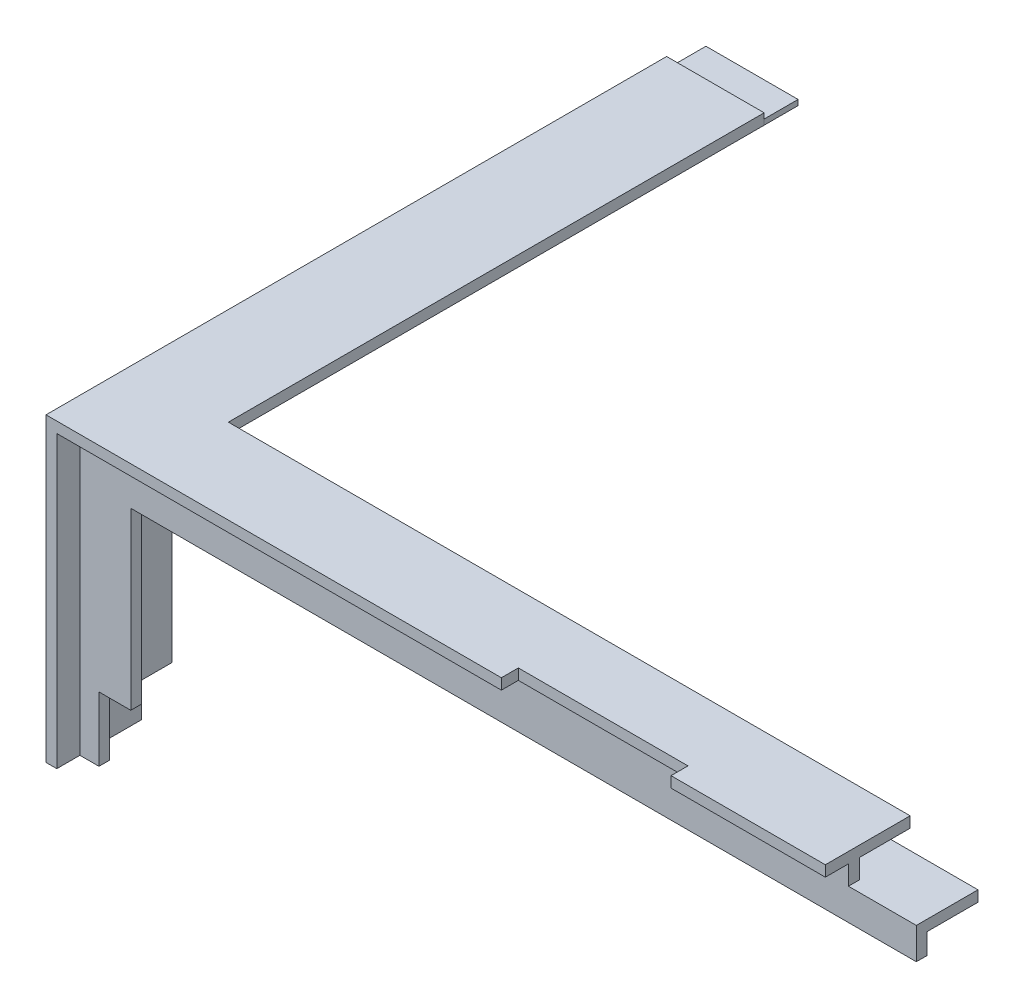
ISO-10303-21;
HEADER;
FILE_DESCRIPTION(('STEP AP214'),'2;1');
FILE_NAME('part.step','',(''),(''),'','','');
FILE_SCHEMA(('AUTOMOTIVE_DESIGN { 1 0 10303 214 1 1 1 1 }'));
ENDSEC;
DATA;
#1=APPLICATION_CONTEXT('core data for automotive mechanical design processes');
#2=APPLICATION_PROTOCOL_DEFINITION('international standard','automotive_design',2000,#1);
#3=PRODUCT_CONTEXT('',#1,'mechanical');
#4=PRODUCT('Part','Part','',(#3));
#5=PRODUCT_RELATED_PRODUCT_CATEGORY('part','',(#4));
#6=PRODUCT_DEFINITION_FORMATION('','',#4);
#7=PRODUCT_DEFINITION_CONTEXT('part definition',#1,'design');
#8=PRODUCT_DEFINITION('design','',#6,#7);
#9=PRODUCT_DEFINITION_SHAPE('','',#8);
#10=(LENGTH_UNIT() NAMED_UNIT(*) SI_UNIT(.MILLI.,.METRE.));
#11=(NAMED_UNIT(*) PLANE_ANGLE_UNIT() SI_UNIT($,.RADIAN.));
#12=(NAMED_UNIT(*) SI_UNIT($,.STERADIAN.) SOLID_ANGLE_UNIT());
#13=UNCERTAINTY_MEASURE_WITH_UNIT(LENGTH_MEASURE(1.E-05),#10,'distance_accuracy_value','');
#14=(GEOMETRIC_REPRESENTATION_CONTEXT(3) GLOBAL_UNCERTAINTY_ASSIGNED_CONTEXT((#13)) GLOBAL_UNIT_ASSIGNED_CONTEXT((#10,
#11,#12)) REPRESENTATION_CONTEXT('',''));
#15=CARTESIAN_POINT('',(0.,0.,0.));
#16=DIRECTION('',(0.,0.,1.));
#17=DIRECTION('',(1.,0.,0.));
#18=AXIS2_PLACEMENT_3D('',#15,#16,#17);
#19=CARTESIAN_POINT('',(244.15125,489.407550000029,28.18));
#20=DIRECTION('',(1.,0.,0.));
#21=DIRECTION('',(0.,0.,-1.));
#22=AXIS2_PLACEMENT_3D('',#19,#20,#21);
#23=PLANE('',#22);
#24=DIRECTION('',(0.,1.,0.));
#25=VECTOR('',#24,1.);
#26=CARTESIAN_POINT('',(244.15125,0.,3.18));
#27=LINE('',#26,#25);
#28=CARTESIAN_POINT('',(244.15125,480.122550000029,3.18));
#29=VERTEX_POINT('',#28);
#30=CARTESIAN_POINT('',(244.15125,489.407550000029,3.18));
#31=VERTEX_POINT('',#30);
#32=EDGE_CURVE('E154',#29,#31,#27,.T.);
#33=ORIENTED_EDGE('',*,*,#32,.F.);
#34=DIRECTION('',(0.,0.,-1.));
#35=VECTOR('',#34,1.);
#36=CARTESIAN_POINT('',(244.15125,480.122550000029,-398.95052983774));
#37=LINE('',#36,#35);
#38=CARTESIAN_POINT('',(244.15125,480.122550000029,0.));
#39=VERTEX_POINT('',#38);
#40=EDGE_CURVE('E205',#29,#39,#37,.T.);
#41=ORIENTED_EDGE('',*,*,#40,.T.);
#42=DIRECTION('',(0.,1.,0.));
#43=VECTOR('',#42,1.);
#44=CARTESIAN_POINT('',(244.15125,0.,0.));
#45=LINE('',#44,#43);
#46=CARTESIAN_POINT('',(244.15125,486.227550000029,0.));
#47=VERTEX_POINT('',#46);
#48=EDGE_CURVE('E184',#39,#47,#45,.T.);
#49=ORIENTED_EDGE('',*,*,#48,.T.);
#50=DIRECTION('',(0.,0.,-1.));
#51=VECTOR('',#50,1.);
#52=CARTESIAN_POINT('',(244.15125,486.227550000029,-15.));
#53=LINE('',#52,#51);
#54=CARTESIAN_POINT('',(244.15125,486.227550000029,-15.));
#55=VERTEX_POINT('',#54);
#56=EDGE_CURVE('E190',#47,#55,#53,.T.);
#57=ORIENTED_EDGE('',*,*,#56,.T.);
#58=DIRECTION('',(0.,-1.,0.));
#59=VECTOR('',#58,1.);
#60=CARTESIAN_POINT('',(244.15125,0.,-15.));
#61=LINE('',#60,#59);
#62=CARTESIAN_POINT('',(244.15125,489.407550000029,-15.));
#63=VERTEX_POINT('',#62);
#64=EDGE_CURVE('E136',#63,#55,#61,.T.);
#65=ORIENTED_EDGE('',*,*,#64,.F.);
#66=DIRECTION('',(0.,0.,-1.));
#67=VECTOR('',#66,1.);
#68=CARTESIAN_POINT('',(244.15125,489.407550000029,28.18));
#69=LINE('',#68,#67);
#70=EDGE_CURVE('E121',#31,#63,#69,.T.);
#71=ORIENTED_EDGE('',*,*,#70,.F.);
#72=EDGE_LOOP('',(#33,#41,#49,#57,#65,#71));
#73=FACE_BOUND('',#72,.T.);
#74=ADVANCED_FACE('F38',(#73),#23,.T.);
#75=CARTESIAN_POINT('',(224.15125,502.016950330966,28.18));
#76=DIRECTION('',(1.,0.,0.));
#77=DIRECTION('',(0.,0.,-1.));
#78=AXIS2_PLACEMENT_3D('',#75,#76,#77);
#79=PLANE('',#78);
#80=DIRECTION('',(0.,1.,0.));
#81=VECTOR('',#80,1.);
#82=CARTESIAN_POINT('',(224.15125,0.,3.18));
#83=LINE('',#82,#81);
#84=CARTESIAN_POINT('',(224.15125,489.407550000029,3.18));
#85=VERTEX_POINT('',#84);
#86=CARTESIAN_POINT('',(224.15125,495.122550000029,3.18));
#87=VERTEX_POINT('',#86);
#88=EDGE_CURVE('E160',#85,#87,#83,.T.);
#89=ORIENTED_EDGE('',*,*,#88,.F.);
#90=DIRECTION('',(0.,0.,-1.));
#91=VECTOR('',#90,1.);
#92=CARTESIAN_POINT('',(224.15125,489.407550000029,28.18));
#93=LINE('',#92,#91);
#94=CARTESIAN_POINT('',(224.15125,489.407550000029,0.));
#95=VERTEX_POINT('',#94);
#96=EDGE_CURVE('E124',#85,#95,#93,.T.);
#97=ORIENTED_EDGE('',*,*,#96,.T.);
#98=DIRECTION('',(0.,1.,0.));
#99=VECTOR('',#98,1.);
#100=CARTESIAN_POINT('',(224.15125,0.,0.));
#101=LINE('',#100,#99);
#102=CARTESIAN_POINT('',(224.15125,495.122550000029,0.));
#103=VERTEX_POINT('',#102);
#104=EDGE_CURVE('E172',#95,#103,#101,.T.);
#105=ORIENTED_EDGE('',*,*,#104,.T.);
#106=DIRECTION('',(0.,0.,-1.));
#107=VECTOR('',#106,1.);
#108=CARTESIAN_POINT('',(224.15125,495.122550000029,-172.932));
#109=LINE('',#108,#107);
#110=CARTESIAN_POINT('',(224.15125,495.122550000029,-15.));
#111=VERTEX_POINT('',#110);
#112=EDGE_CURVE('E199',#103,#111,#109,.T.);
#113=ORIENTED_EDGE('',*,*,#112,.T.);
#114=DIRECTION('',(0.,1.,0.));
#115=VECTOR('',#114,1.);
#116=CARTESIAN_POINT('',(224.15125,0.,-15.));
#117=LINE('',#116,#115);
#118=CARTESIAN_POINT('',(224.15125,498.297550000029,-15.));
#119=VERTEX_POINT('',#118);
#120=EDGE_CURVE('E211',#111,#119,#117,.T.);
#121=ORIENTED_EDGE('',*,*,#120,.T.);
#122=DIRECTION('',(0.,0.,1.));
#123=VECTOR('',#122,1.);
#124=CARTESIAN_POINT('',(224.15125,498.297550000029,10.));
#125=LINE('',#124,#123);
#126=CARTESIAN_POINT('',(224.15125,498.297550000029,10.));
#127=VERTEX_POINT('',#126);
#128=EDGE_CURVE('E193',#119,#127,#125,.T.);
#129=ORIENTED_EDGE('',*,*,#128,.T.);
#130=DIRECTION('',(0.,1.,0.));
#131=VECTOR('',#130,1.);
#132=CARTESIAN_POINT('',(224.15125,0.,10.));
#133=LINE('',#132,#131);
#134=CARTESIAN_POINT('',(224.15125,495.122550000029,10.));
#135=VERTEX_POINT('',#134);
#136=EDGE_CURVE('E163',#135,#127,#133,.T.);
#137=ORIENTED_EDGE('',*,*,#136,.F.);
#138=DIRECTION('',(0.,0.,1.));
#139=VECTOR('',#138,1.);
#140=CARTESIAN_POINT('',(224.15125,495.122550000029,10.));
#141=LINE('',#140,#139);
#142=EDGE_CURVE('E166',#87,#135,#141,.T.);
#143=ORIENTED_EDGE('',*,*,#142,.F.);
#144=EDGE_LOOP('',(#89,#97,#105,#113,#121,#129,#137,#143));
#145=FACE_BOUND('',#144,.T.);
#146=ADVANCED_FACE('F547',(#145),#79,.T.);
#147=CARTESIAN_POINT('',(224.15125,489.407550000029,28.18));
#148=DIRECTION('',(0.,1.,0.));
#149=DIRECTION('',(-1.,0.,0.));
#150=AXIS2_PLACEMENT_3D('',#147,#148,#149);
#151=PLANE('',#150);
#152=DIRECTION('',(-1.,0.,0.));
#153=VECTOR('',#152,1.);
#154=CARTESIAN_POINT('',(1.35837882608855E-12,489.40755000003,3.18));
#155=LINE('',#154,#153);
#156=EDGE_CURVE('E157',#31,#85,#155,.T.);
#157=ORIENTED_EDGE('',*,*,#156,.F.);
#158=ORIENTED_EDGE('',*,*,#70,.T.);
#159=DIRECTION('',(1.,0.,0.));
#160=VECTOR('',#159,1.);
#161=CARTESIAN_POINT('',(304.00625,489.407550000029,-15.));
#162=LINE('',#161,#160);
#163=CARTESIAN_POINT('',(3.33375000000002,489.407550000029,-15.));
#164=VERTEX_POINT('',#163);
#165=EDGE_CURVE('E272',#164,#63,#162,.T.);
#166=ORIENTED_EDGE('',*,*,#165,.F.);
#167=DIRECTION('',(0.,0.,1.));
#168=VECTOR('',#167,1.);
#169=CARTESIAN_POINT('',(3.33375000000002,489.407550000029,-15.));
#170=LINE('',#169,#168);
#171=CARTESIAN_POINT('',(3.33375000000002,489.407550000029,0.));
#172=VERTEX_POINT('',#171);
#173=EDGE_CURVE('E271',#164,#172,#170,.T.);
#174=ORIENTED_EDGE('',*,*,#173,.T.);
#175=DIRECTION('',(1.,0.,0.));
#176=VECTOR('',#175,1.);
#177=CARTESIAN_POINT('',(304.00625,489.407550000029,0.));
#178=LINE('',#177,#176);
#179=EDGE_CURVE('E127',#172,#95,#178,.T.);
#180=ORIENTED_EDGE('',*,*,#179,.T.);
#181=ORIENTED_EDGE('',*,*,#96,.F.);
#182=EDGE_LOOP('',(#157,#158,#166,#174,#180,#181));
#183=FACE_BOUND('',#182,.T.);
#184=ADVANCED_FACE('F554',(#183),#151,.T.);
#185=CARTESIAN_POINT('',(27.1549810482362,428.552550000031,28.18));
#186=DIRECTION('',(0.,-1.,0.));
#187=DIRECTION('',(0.,0.,-1.));
#188=AXIS2_PLACEMENT_3D('',#185,#186,#187);
#189=PLANE('',#188);
#190=DIRECTION('',(1.,0.,0.));
#191=VECTOR('',#190,1.);
#192=CARTESIAN_POINT('',(0.,428.552550000031,3.18));
#193=LINE('',#192,#191);
#194=CARTESIAN_POINT('',(3.23375000000008,428.552550000031,3.18));
#195=VERTEX_POINT('',#194);
#196=CARTESIAN_POINT('',(12.61875,428.552550000031,3.18));
#197=VERTEX_POINT('',#196);
#198=EDGE_CURVE('E145',#195,#197,#193,.T.);
#199=ORIENTED_EDGE('',*,*,#198,.F.);
#200=DIRECTION('',(0.,0.,-1.));
#201=VECTOR('',#200,1.);
#202=CARTESIAN_POINT('',(3.23375000000008,428.552550000031,28.18));
#203=LINE('',#202,#201);
#204=CARTESIAN_POINT('',(3.23375000000008,428.552550000031,0.));
#205=VERTEX_POINT('',#204);
#206=EDGE_CURVE('E48',#195,#205,#203,.T.);
#207=ORIENTED_EDGE('',*,*,#206,.T.);
#208=DIRECTION('',(1.,0.,0.));
#209=VECTOR('',#208,1.);
#210=CARTESIAN_POINT('',(0.,428.552550000031,0.));
#211=LINE('',#210,#209);
#212=CARTESIAN_POINT('',(3.33375000000002,428.552550000031,0.));
#213=VERTEX_POINT('',#212);
#214=EDGE_CURVE('E181',#205,#213,#211,.T.);
#215=ORIENTED_EDGE('',*,*,#214,.T.);
#216=DIRECTION('',(0.,0.,-1.));
#217=VECTOR('',#216,1.);
#218=CARTESIAN_POINT('',(3.33375000000002,428.552550000031,-15.));
#219=LINE('',#218,#217);
#220=CARTESIAN_POINT('',(3.33375000000002,428.552550000031,-15.));
#221=VERTEX_POINT('',#220);
#222=EDGE_CURVE('E208',#213,#221,#219,.T.);
#223=ORIENTED_EDGE('',*,*,#222,.T.);
#224=DIRECTION('',(-1.,0.,0.));
#225=VECTOR('',#224,1.);
#226=CARTESIAN_POINT('',(0.,428.552550000031,-15.));
#227=LINE('',#226,#225);
#228=CARTESIAN_POINT('',(6.51375000000112,428.552550000031,-15.));
#229=VERTEX_POINT('',#228);
#230=EDGE_CURVE('E132',#229,#221,#227,.T.);
#231=ORIENTED_EDGE('',*,*,#230,.F.);
#232=DIRECTION('',(0.,0.,1.));
#233=VECTOR('',#232,1.);
#234=CARTESIAN_POINT('',(6.51375000000112,428.552550000031,-15.));
#235=LINE('',#234,#233);
#236=CARTESIAN_POINT('',(6.51375000000112,428.552550000031,0.));
#237=VERTEX_POINT('',#236);
#238=EDGE_CURVE('E214',#229,#237,#235,.T.);
#239=ORIENTED_EDGE('',*,*,#238,.T.);
#240=DIRECTION('',(1.,0.,0.));
#241=VECTOR('',#240,1.);
#242=CARTESIAN_POINT('',(0.,428.552550000031,0.));
#243=LINE('',#242,#241);
#244=CARTESIAN_POINT('',(12.61875,428.552550000031,0.));
#245=VERTEX_POINT('',#244);
#246=EDGE_CURVE('E187',#237,#245,#243,.T.);
#247=ORIENTED_EDGE('',*,*,#246,.T.);
#248=DIRECTION('',(0.,0.,1.));
#249=VECTOR('',#248,1.);
#250=CARTESIAN_POINT('',(12.61875,428.552550000031,-398.95052983774));
#251=LINE('',#250,#249);
#252=EDGE_CURVE('E202',#245,#197,#251,.T.);
#253=ORIENTED_EDGE('',*,*,#252,.T.);
#254=EDGE_LOOP('',(#199,#207,#215,#223,#231,#239,#247,#253));
#255=FACE_BOUND('',#254,.T.);
#256=ADVANCED_FACE('F565',(#255),#189,.T.);
#257=CARTESIAN_POINT('',(3.23375000000008,409.552550000031,28.18));
#258=DIRECTION('',(0.,-1.,0.));
#259=DIRECTION('',(0.,0.,-1.));
#260=AXIS2_PLACEMENT_3D('',#257,#258,#259);
#261=PLANE('',#260);
#262=DIRECTION('',(1.,0.,0.));
#263=VECTOR('',#262,1.);
#264=CARTESIAN_POINT('',(0.,409.552550000031,3.18));
#265=LINE('',#264,#263);
#266=CARTESIAN_POINT('',(-2.38125,409.552550000031,3.18));
#267=VERTEX_POINT('',#266);
#268=CARTESIAN_POINT('',(3.23375000000008,409.552550000031,3.18));
#269=VERTEX_POINT('',#268);
#270=EDGE_CURVE('E151',#267,#269,#265,.T.);
#271=ORIENTED_EDGE('',*,*,#270,.F.);
#272=DIRECTION('',(0.,0.,-1.));
#273=VECTOR('',#272,1.);
#274=CARTESIAN_POINT('',(-2.38125,409.552550000031,10.));
#275=LINE('',#274,#273);
#276=CARTESIAN_POINT('',(-2.38125,409.552550000031,10.));
#277=VERTEX_POINT('',#276);
#278=EDGE_CURVE('E142',#277,#267,#275,.T.);
#279=ORIENTED_EDGE('',*,*,#278,.F.);
#280=DIRECTION('',(1.,0.,0.));
#281=VECTOR('',#280,1.);
#282=CARTESIAN_POINT('',(0.,409.552550000031,10.));
#283=LINE('',#282,#281);
#284=CARTESIAN_POINT('',(-5.55624999999998,409.552550000031,10.));
#285=VERTEX_POINT('',#284);
#286=EDGE_CURVE('E169',#285,#277,#283,.T.);
#287=ORIENTED_EDGE('',*,*,#286,.F.);
#288=DIRECTION('',(0.,0.,-1.));
#289=VECTOR('',#288,1.);
#290=CARTESIAN_POINT('',(-5.55624999999998,409.552550000031,10.));
#291=LINE('',#290,#289);
#292=CARTESIAN_POINT('',(-5.55624999999917,409.552550000031,-15.));
#293=VERTEX_POINT('',#292);
#294=EDGE_CURVE('E196',#285,#293,#291,.T.);
#295=ORIENTED_EDGE('',*,*,#294,.T.);
#296=DIRECTION('',(1.,0.,0.));
#297=VECTOR('',#296,1.);
#298=CARTESIAN_POINT('',(492.741300000027,409.552550000031,-15.));
#299=LINE('',#298,#297);
#300=CARTESIAN_POINT('',(-2.38124999999908,409.552550000031,-15.));
#301=VERTEX_POINT('',#300);
#302=EDGE_CURVE('E217',#293,#301,#299,.T.);
#303=ORIENTED_EDGE('',*,*,#302,.T.);
#304=DIRECTION('',(0.,0.,-1.));
#305=VECTOR('',#304,1.);
#306=CARTESIAN_POINT('',(-2.38125,409.552550000031,50.6536762437555));
#307=LINE('',#306,#305);
#308=CARTESIAN_POINT('',(-2.38125,409.552550000031,0.));
#309=VERTEX_POINT('',#308);
#310=EDGE_CURVE('E139',#309,#301,#307,.T.);
#311=ORIENTED_EDGE('',*,*,#310,.F.);
#312=DIRECTION('',(1.,0.,0.));
#313=VECTOR('',#312,1.);
#314=CARTESIAN_POINT('',(0.,409.552550000031,0.));
#315=LINE('',#314,#313);
#316=CARTESIAN_POINT('',(3.23375000000008,409.552550000031,0.));
#317=VERTEX_POINT('',#316);
#318=EDGE_CURVE('E175',#309,#317,#315,.T.);
#319=ORIENTED_EDGE('',*,*,#318,.T.);
#320=DIRECTION('',(0.,0.,-1.));
#321=VECTOR('',#320,1.);
#322=CARTESIAN_POINT('',(3.23375000000008,409.552550000031,28.18));
#323=LINE('',#322,#321);
#324=EDGE_CURVE('E11',#269,#317,#323,.T.);
#325=ORIENTED_EDGE('',*,*,#324,.F.);
#326=EDGE_LOOP('',(#271,#279,#287,#295,#303,#311,#319,#325));
#327=FACE_BOUND('',#326,.T.);
#328=ADVANCED_FACE('F399',(#327),#261,.T.);
#329=CARTESIAN_POINT('',(3.23375000000008,428.552550000031,28.18));
#330=DIRECTION('',(1.,0.,0.));
#331=DIRECTION('',(0.,1.,0.));
#332=AXIS2_PLACEMENT_3D('',#329,#330,#331);
#333=PLANE('',#332);
#334=ORIENTED_EDGE('',*,*,#324,.T.);
#335=DIRECTION('',(0.,1.,0.));
#336=VECTOR('',#335,1.);
#337=CARTESIAN_POINT('',(3.23375000000004,0.,0.));
#338=LINE('',#337,#336);
#339=EDGE_CURVE('E178',#317,#205,#338,.T.);
#340=ORIENTED_EDGE('',*,*,#339,.T.);
#341=ORIENTED_EDGE('',*,*,#206,.F.);
#342=DIRECTION('',(0.,1.,0.));
#343=VECTOR('',#342,1.);
#344=CARTESIAN_POINT('',(3.23375000000004,0.,3.18));
#345=LINE('',#344,#343);
#346=EDGE_CURVE('E148',#269,#195,#345,.T.);
#347=ORIENTED_EDGE('',*,*,#346,.F.);
#348=EDGE_LOOP('',(#334,#340,#341,#347));
#349=FACE_BOUND('',#348,.T.);
#350=ADVANCED_FACE('F569',(#349),#333,.T.);
#351=CARTESIAN_POINT('',(492.741300000029,496.71005000003,-182.932));
#352=DIRECTION('',(0.,-1.,0.));
#353=DIRECTION('',(1.,0.,0.));
#354=AXIS2_PLACEMENT_3D('',#351,#352,#353);
#355=PLANE('',#354);
#356=DIRECTION('',(1.,0.,0.));
#357=VECTOR('',#356,1.);
#358=CARTESIAN_POINT('',(492.741300000029,496.71005000003,-172.932));
#359=LINE('',#358,#357);
#360=CARTESIAN_POINT('',(-3.96875000000046,496.710050000029,-172.932));
#361=VERTEX_POINT('',#360);
#362=CARTESIAN_POINT('',(23.1879802270042,496.710050000029,-172.932));
#363=VERTEX_POINT('',#362);
#364=EDGE_CURVE('E116',#361,#363,#359,.T.);
#365=ORIENTED_EDGE('',*,*,#364,.T.);
#366=DIRECTION('',(0.,0.,1.));
#367=VECTOR('',#366,1.);
#368=CARTESIAN_POINT('',(23.1879802270042,496.710050000029,-182.932));
#369=LINE('',#368,#367);
#370=CARTESIAN_POINT('',(23.1879802270042,496.710050000029,-182.932));
#371=VERTEX_POINT('',#370);
#372=EDGE_CURVE('E321',#371,#363,#369,.T.);
#373=ORIENTED_EDGE('',*,*,#372,.F.);
#374=DIRECTION('',(1.,0.,0.));
#375=VECTOR('',#374,1.);
#376=CARTESIAN_POINT('',(492.741300000029,496.71005000003,-182.932));
#377=LINE('',#376,#375);
#378=CARTESIAN_POINT('',(-3.96875000000046,496.710050000029,-182.932));
#379=VERTEX_POINT('',#378);
#380=EDGE_CURVE('E323',#379,#371,#377,.T.);
#381=ORIENTED_EDGE('',*,*,#380,.F.);
#382=DIRECTION('',(0.,0.,1.));
#383=VECTOR('',#382,1.);
#384=CARTESIAN_POINT('',(-3.96875000000046,496.710050000029,-182.932));
#385=LINE('',#384,#383);
#386=EDGE_CURVE('E318',#379,#361,#385,.T.);
#387=ORIENTED_EDGE('',*,*,#386,.T.);
#388=EDGE_LOOP('',(#365,#373,#381,#387));
#389=FACE_BOUND('',#388,.T.);
#390=ADVANCED_FACE('F339',(#389),#355,.F.);
#391=CARTESIAN_POINT('',(-3.96874999999935,185.401300000028,-182.932));
#392=DIRECTION('',(1.,0.,0.));
#393=DIRECTION('',(0.,1.,0.));
#394=AXIS2_PLACEMENT_3D('',#391,#392,#393);
#395=PLANE('',#394);
#396=DIRECTION('',(0.,1.,0.));
#397=VECTOR('',#396,1.);
#398=CARTESIAN_POINT('',(-3.96874999999935,185.401300000028,-172.932));
#399=LINE('',#398,#397);
#400=CARTESIAN_POINT('',(-3.96875000000039,469.552550000029,-172.932));
#401=VERTEX_POINT('',#400);
#402=EDGE_CURVE('E326',#401,#361,#399,.T.);
#403=ORIENTED_EDGE('',*,*,#402,.T.);
#404=ORIENTED_EDGE('',*,*,#386,.F.);
#405=DIRECTION('',(0.,1.,0.));
#406=VECTOR('',#405,1.);
#407=CARTESIAN_POINT('',(-3.96874999999935,185.401300000028,-182.932));
#408=LINE('',#407,#406);
#409=CARTESIAN_POINT('',(-3.96875000000035,469.552550000028,-182.932));
#410=VERTEX_POINT('',#409);
#411=EDGE_CURVE('E112',#410,#379,#408,.T.);
#412=ORIENTED_EDGE('',*,*,#411,.F.);
#413=DIRECTION('',(0.,0.,1.));
#414=VECTOR('',#413,1.);
#415=CARTESIAN_POINT('',(-3.96875000000035,469.552550000028,-182.932));
#416=LINE('',#415,#414);
#417=EDGE_CURVE('E311',#410,#401,#416,.T.);
#418=ORIENTED_EDGE('',*,*,#417,.T.);
#419=EDGE_LOOP('',(#403,#404,#412,#418));
#420=FACE_BOUND('',#419,.T.);
#421=ADVANCED_FACE('F335',(#420),#395,.F.);
#422=CARTESIAN_POINT('',(128.67,548.546928105633,9.99999999999999));
#423=DIRECTION('',(-1.,0.,0.));
#424=DIRECTION('',(0.,-1.,0.));
#425=AXIS2_PLACEMENT_3D('',#422,#423,#424);
#426=PLANE('',#425);
#427=DIRECTION('',(0.,0.,-1.));
#428=VECTOR('',#427,1.);
#429=CARTESIAN_POINT('',(128.67,495.122550000029,10.));
#430=LINE('',#429,#428);
#431=CARTESIAN_POINT('',(128.67,495.122550000029,9.99999999999999));
#432=VERTEX_POINT('',#431);
#433=CARTESIAN_POINT('',(128.67,495.122550000029,4.99999999999999));
#434=VERTEX_POINT('',#433);
#435=EDGE_CURVE('E257',#432,#434,#430,.T.);
#436=ORIENTED_EDGE('',*,*,#435,.T.);
#437=DIRECTION('',(0.,-1.,0.));
#438=VECTOR('',#437,1.);
#439=CARTESIAN_POINT('',(128.67,548.546928105633,4.99999999999999));
#440=LINE('',#439,#438);
#441=CARTESIAN_POINT('',(128.67,498.297550000029,4.99999999999999));
#442=VERTEX_POINT('',#441);
#443=EDGE_CURVE('E268',#442,#434,#440,.T.);
#444=ORIENTED_EDGE('',*,*,#443,.F.);
#445=DIRECTION('',(0.,0.,1.));
#446=VECTOR('',#445,1.);
#447=CARTESIAN_POINT('',(128.67,498.297550000029,9.99999999999999));
#448=LINE('',#447,#446);
#449=CARTESIAN_POINT('',(128.67,498.297550000029,9.99999999999999));
#450=VERTEX_POINT('',#449);
#451=EDGE_CURVE('E531',#442,#450,#448,.T.);
#452=ORIENTED_EDGE('',*,*,#451,.T.);
#453=DIRECTION('',(0.,-1.,0.));
#454=VECTOR('',#453,1.);
#455=CARTESIAN_POINT('',(128.67,548.546928105633,9.99999999999999));
#456=LINE('',#455,#454);
#457=EDGE_CURVE('E258',#450,#432,#456,.T.);
#458=ORIENTED_EDGE('',*,*,#457,.T.);
#459=EDGE_LOOP('',(#436,#444,#452,#458));
#460=FACE_BOUND('',#459,.T.);
#461=ADVANCED_FACE('F590',(#460),#426,.F.);
#462=CARTESIAN_POINT('',(128.67,548.546928105633,4.99999999999999));
#463=DIRECTION('',(0.,0.,-1.));
#464=DIRECTION('',(-1.,0.,0.));
#465=AXIS2_PLACEMENT_3D('',#462,#463,#464);
#466=PLANE('',#465);
#467=DIRECTION('',(1.,0.,0.));
#468=VECTOR('',#467,1.);
#469=CARTESIAN_POINT('',(0.,495.122550000029,4.99999999999997));
#470=LINE('',#469,#468);
#471=CARTESIAN_POINT('',(178.67,495.122550000029,5.));
#472=VERTEX_POINT('',#471);
#473=EDGE_CURVE('E527',#434,#472,#470,.T.);
#474=ORIENTED_EDGE('',*,*,#473,.T.);
#475=DIRECTION('',(0.,-1.,0.));
#476=VECTOR('',#475,1.);
#477=CARTESIAN_POINT('',(178.67,548.546928105633,5.));
#478=LINE('',#477,#476);
#479=CARTESIAN_POINT('',(178.67,498.297550000029,5.));
#480=VERTEX_POINT('',#479);
#481=EDGE_CURVE('E265',#480,#472,#478,.T.);
#482=ORIENTED_EDGE('',*,*,#481,.F.);
#483=DIRECTION('',(-1.,0.,0.));
#484=VECTOR('',#483,1.);
#485=CARTESIAN_POINT('',(128.67,498.297550000029,4.99999999999999));
#486=LINE('',#485,#484);
#487=EDGE_CURVE('E529',#480,#442,#486,.T.);
#488=ORIENTED_EDGE('',*,*,#487,.T.);
#489=ORIENTED_EDGE('',*,*,#443,.T.);
#490=EDGE_LOOP('',(#474,#482,#488,#489));
#491=FACE_BOUND('',#490,.T.);
#492=ADVANCED_FACE('F611',(#491),#466,.F.);
#493=CARTESIAN_POINT('',(178.67,548.546928105633,10.));
#494=DIRECTION('',(1.,0.,0.));
#495=DIRECTION('',(0.,0.,-1.));
#496=AXIS2_PLACEMENT_3D('',#493,#494,#495);
#497=PLANE('',#496);
#498=DIRECTION('',(0.,0.,1.));
#499=VECTOR('',#498,1.);
#500=CARTESIAN_POINT('',(178.67,495.122550000029,10.000000000001));
#501=LINE('',#500,#499);
#502=CARTESIAN_POINT('',(178.67,495.122550000029,10.));
#503=VERTEX_POINT('',#502);
#504=EDGE_CURVE('E524',#472,#503,#501,.T.);
#505=ORIENTED_EDGE('',*,*,#504,.T.);
#506=DIRECTION('',(0.,-1.,0.));
#507=VECTOR('',#506,1.);
#508=CARTESIAN_POINT('',(178.67,548.546928105633,10.));
#509=LINE('',#508,#507);
#510=CARTESIAN_POINT('',(178.67,498.297550000029,10.));
#511=VERTEX_POINT('',#510);
#512=EDGE_CURVE('E261',#511,#503,#509,.T.);
#513=ORIENTED_EDGE('',*,*,#512,.F.);
#514=DIRECTION('',(0.,0.,-1.));
#515=VECTOR('',#514,1.);
#516=CARTESIAN_POINT('',(178.67,498.297550000029,10.));
#517=LINE('',#516,#515);
#518=EDGE_CURVE('E262',#511,#480,#517,.T.);
#519=ORIENTED_EDGE('',*,*,#518,.T.);
#520=ORIENTED_EDGE('',*,*,#481,.T.);
#521=EDGE_LOOP('',(#505,#513,#519,#520));
#522=FACE_BOUND('',#521,.T.);
#523=ADVANCED_FACE('F615',(#522),#497,.F.);
#524=CARTESIAN_POINT('',(0.,495.122550000029,10.));
#525=DIRECTION('',(0.,-1.,0.));
#526=DIRECTION('',(1.,0.,0.));
#527=AXIS2_PLACEMENT_3D('',#524,#525,#526);
#528=PLANE('',#527);
#529=DIRECTION('',(-1.,0.,0.));
#530=VECTOR('',#529,1.);
#531=CARTESIAN_POINT('',(0.,495.122550000029,3.18));
#532=LINE('',#531,#530);
#533=CARTESIAN_POINT('',(-2.38125,495.122550000029,3.18));
#534=VERTEX_POINT('',#533);
#535=EDGE_CURVE('E135',#87,#534,#532,.T.);
#536=ORIENTED_EDGE('',*,*,#535,.F.);
#537=ORIENTED_EDGE('',*,*,#142,.T.);
#538=DIRECTION('',(-1.,0.,0.));
#539=VECTOR('',#538,1.);
#540=CARTESIAN_POINT('',(0.,495.122550000029,10.));
#541=LINE('',#540,#539);
#542=EDGE_CURVE('E222',#135,#503,#541,.T.);
#543=ORIENTED_EDGE('',*,*,#542,.T.);
#544=ORIENTED_EDGE('',*,*,#504,.F.);
#545=ORIENTED_EDGE('',*,*,#473,.F.);
#546=ORIENTED_EDGE('',*,*,#435,.F.);
#547=CARTESIAN_POINT('',(-2.38125,495.122550000029,10.));
#548=VERTEX_POINT('',#547);
#549=EDGE_CURVE('E225',#432,#548,#541,.T.);
#550=ORIENTED_EDGE('',*,*,#549,.T.);
#551=DIRECTION('',(0.,0.,-1.));
#552=VECTOR('',#551,1.);
#553=CARTESIAN_POINT('',(-2.38125,495.122550000029,50.6536762437555));
#554=LINE('',#553,#552);
#555=EDGE_CURVE('E94',#548,#534,#554,.T.);
#556=ORIENTED_EDGE('',*,*,#555,.T.);
#557=EDGE_LOOP('',(#536,#537,#543,#544,#545,#546,#550,#556));
#558=FACE_BOUND('',#557,.T.);
#559=ADVANCED_FACE('F496',(#558),#528,.T.);
#560=CARTESIAN_POINT('',(0.,0.,-172.932));
#561=DIRECTION('',(0.,0.,1.));
#562=DIRECTION('',(1.,0.,0.));
#563=AXIS2_PLACEMENT_3D('',#560,#561,#562);
#564=PLANE('',#563);
#565=DIRECTION('',(0.,-1.,0.));
#566=VECTOR('',#565,1.);
#567=CARTESIAN_POINT('',(23.18875,0.,-172.932));
#568=LINE('',#567,#566);
#569=CARTESIAN_POINT('',(23.18875,498.297550000029,-172.932));
#570=VERTEX_POINT('',#569);
#571=CARTESIAN_POINT('',(23.18875,495.122550000029,-172.932));
#572=VERTEX_POINT('',#571);
#573=EDGE_CURVE('E247',#570,#572,#568,.T.);
#574=ORIENTED_EDGE('',*,*,#573,.T.);
#575=DIRECTION('',(-0.000484896318298934,0.999999882437773,0.));
#576=VECTOR('',#575,1.);
#577=CARTESIAN_POINT('',(23.3390430794483,185.17368854709,-172.932));
#578=LINE('',#577,#576);
#579=EDGE_CURVE('E56',#572,#363,#578,.T.);
#580=ORIENTED_EDGE('',*,*,#579,.T.);
#581=ORIENTED_EDGE('',*,*,#364,.F.);
#582=ORIENTED_EDGE('',*,*,#402,.F.);
#583=DIRECTION('',(-1.,0.,0.));
#584=VECTOR('',#583,1.);
#585=CARTESIAN_POINT('',(0.,469.552550000029,-172.932));
#586=LINE('',#585,#584);
#587=CARTESIAN_POINT('',(-5.55624999999998,469.552550000029,-172.932));
#588=VERTEX_POINT('',#587);
#589=EDGE_CURVE('E93',#401,#588,#586,.T.);
#590=ORIENTED_EDGE('',*,*,#589,.T.);
#591=DIRECTION('',(0.,-1.,0.));
#592=VECTOR('',#591,1.);
#593=CARTESIAN_POINT('',(-5.55624999999995,0.,-172.932));
#594=LINE('',#593,#592);
#595=CARTESIAN_POINT('',(-5.55624999999998,498.297550000029,-172.932));
#596=VERTEX_POINT('',#595);
#597=EDGE_CURVE('E514',#596,#588,#594,.T.);
#598=ORIENTED_EDGE('',*,*,#597,.F.);
#599=DIRECTION('',(-1.,0.,0.));
#600=VECTOR('',#599,1.);
#601=CARTESIAN_POINT('',(0.,498.297550000029,-172.932));
#602=LINE('',#601,#600);
#603=EDGE_CURVE('E517',#570,#596,#602,.T.);
#604=ORIENTED_EDGE('',*,*,#603,.F.);
#605=EDGE_LOOP('',(#574,#580,#581,#582,#590,#598,#604));
#606=FACE_BOUND('',#605,.T.);
#607=ADVANCED_FACE('F622',(#606),#564,.F.);
#608=CARTESIAN_POINT('',(0.,0.,10.));
#609=DIRECTION('',(0.,0.,1.));
#610=DIRECTION('',(1.,0.,0.));
#611=AXIS2_PLACEMENT_3D('',#608,#609,#610);
#612=PLANE('',#611);
#613=DIRECTION('',(0.,-1.,0.));
#614=VECTOR('',#613,1.);
#615=CARTESIAN_POINT('',(-5.55624999999995,0.,10.));
#616=LINE('',#615,#614);
#617=CARTESIAN_POINT('',(-5.55624999999998,498.297550000029,10.));
#618=VERTEX_POINT('',#617);
#619=EDGE_CURVE('E236',#618,#285,#616,.T.);
#620=ORIENTED_EDGE('',*,*,#619,.T.);
#621=ORIENTED_EDGE('',*,*,#286,.T.);
#622=DIRECTION('',(0.,-1.,0.));
#623=VECTOR('',#622,1.);
#624=CARTESIAN_POINT('',(-2.38124999999998,0.,10.));
#625=LINE('',#624,#623);
#626=EDGE_CURVE('E239',#548,#277,#625,.T.);
#627=ORIENTED_EDGE('',*,*,#626,.F.);
#628=ORIENTED_EDGE('',*,*,#549,.F.);
#629=ORIENTED_EDGE('',*,*,#457,.F.);
#630=DIRECTION('',(-1.,0.,0.));
#631=VECTOR('',#630,1.);
#632=CARTESIAN_POINT('',(0.,498.297550000029,10.));
#633=LINE('',#632,#631);
#634=EDGE_CURVE('E229',#450,#618,#633,.T.);
#635=ORIENTED_EDGE('',*,*,#634,.T.);
#636=EDGE_LOOP('',(#620,#621,#627,#628,#629,#635));
#637=FACE_BOUND('',#636,.T.);
#638=ADVANCED_FACE('F501',(#637),#612,.T.);
#639=CARTESIAN_POINT('',(23.3390430794483,185.17368854709,-182.932));
#640=DIRECTION('',(0.999999882437773,0.000484896318298934,0.));
#641=DIRECTION('',(-0.000484896318298934,0.999999882437773,0.));
#642=AXIS2_PLACEMENT_3D('',#639,#640,#641);
#643=PLANE('',#642);
#644=ORIENTED_EDGE('',*,*,#579,.F.);
#645=DIRECTION('',(0.,0.,1.));
#646=VECTOR('',#645,1.);
#647=CARTESIAN_POINT('',(23.18875,495.122550000029,-182.932));
#648=LINE('',#647,#646);
#649=CARTESIAN_POINT('',(23.18875,495.122550000029,-182.932));
#650=VERTEX_POINT('',#649);
#651=EDGE_CURVE('E309',#650,#572,#648,.T.);
#652=ORIENTED_EDGE('',*,*,#651,.F.);
#653=DIRECTION('',(-0.000484896318298934,0.999999882437773,0.));
#654=VECTOR('',#653,1.);
#655=CARTESIAN_POINT('',(23.3390430794483,185.17368854709,-182.932));
#656=LINE('',#655,#654);
#657=EDGE_CURVE('E104',#650,#371,#656,.T.);
#658=ORIENTED_EDGE('',*,*,#657,.T.);
#659=ORIENTED_EDGE('',*,*,#372,.T.);
#660=EDGE_LOOP('',(#644,#652,#658,#659));
#661=FACE_BOUND('',#660,.T.);
#662=ADVANCED_FACE('F341',(#661),#643,.T.);
#663=CARTESIAN_POINT('',(0.,498.297550000029,10.));
#664=DIRECTION('',(0.,-1.,0.));
#665=DIRECTION('',(1.,0.,0.));
#666=AXIS2_PLACEMENT_3D('',#663,#664,#665);
#667=PLANE('',#666);
#668=ORIENTED_EDGE('',*,*,#128,.F.);
#669=DIRECTION('',(1.,0.,0.));
#670=VECTOR('',#669,1.);
#671=CARTESIAN_POINT('',(284.15125,498.297550000029,-15.));
#672=LINE('',#671,#670);
#673=CARTESIAN_POINT('',(23.18875,498.297550000029,-15.));
#674=VERTEX_POINT('',#673);
#675=EDGE_CURVE('E285',#674,#119,#672,.T.);
#676=ORIENTED_EDGE('',*,*,#675,.F.);
#677=DIRECTION('',(0.,0.,-1.));
#678=VECTOR('',#677,1.);
#679=CARTESIAN_POINT('',(23.18875,498.297550000029,50.6536762437555));
#680=LINE('',#679,#678);
#681=EDGE_CURVE('E511',#674,#570,#680,.T.);
#682=ORIENTED_EDGE('',*,*,#681,.T.);
#683=ORIENTED_EDGE('',*,*,#603,.T.);
#684=DIRECTION('',(0.,0.,-1.));
#685=VECTOR('',#684,1.);
#686=CARTESIAN_POINT('',(-5.55624999999998,498.297550000029,50.6536762437555));
#687=LINE('',#686,#685);
#688=EDGE_CURVE('E509',#618,#596,#687,.T.);
#689=ORIENTED_EDGE('',*,*,#688,.F.);
#690=ORIENTED_EDGE('',*,*,#634,.F.);
#691=ORIENTED_EDGE('',*,*,#451,.F.);
#692=ORIENTED_EDGE('',*,*,#487,.F.);
#693=ORIENTED_EDGE('',*,*,#518,.F.);
#694=EDGE_CURVE('E226',#127,#511,#633,.T.);
#695=ORIENTED_EDGE('',*,*,#694,.F.);
#696=EDGE_LOOP('',(#668,#676,#682,#683,#689,#690,#691,#692,#693,#695));
#697=FACE_BOUND('',#696,.T.);
#698=ADVANCED_FACE('F542',(#697),#667,.F.);
#699=CARTESIAN_POINT('',(23.18875,0.,50.6536762437555));
#700=DIRECTION('',(1.,0.,0.));
#701=DIRECTION('',(0.,0.,-1.));
#702=AXIS2_PLACEMENT_3D('',#699,#700,#701);
#703=PLANE('',#702);
#704=ORIENTED_EDGE('',*,*,#681,.F.);
#705=DIRECTION('',(0.,1.,0.));
#706=VECTOR('',#705,1.);
#707=CARTESIAN_POINT('',(23.18875,495.122550000029,-15.));
#708=LINE('',#707,#706);
#709=CARTESIAN_POINT('',(23.18875,495.122550000029,-15.));
#710=VERTEX_POINT('',#709);
#711=EDGE_CURVE('E288',#710,#674,#708,.T.);
#712=ORIENTED_EDGE('',*,*,#711,.F.);
#713=DIRECTION('',(0.,0.,-1.));
#714=VECTOR('',#713,1.);
#715=CARTESIAN_POINT('',(23.18875,495.122550000029,50.6536762437555));
#716=LINE('',#715,#714);
#717=EDGE_CURVE('E242',#710,#572,#716,.T.);
#718=ORIENTED_EDGE('',*,*,#717,.T.);
#719=ORIENTED_EDGE('',*,*,#573,.F.);
#720=EDGE_LOOP('',(#704,#712,#718,#719));
#721=FACE_BOUND('',#720,.T.);
#722=ADVANCED_FACE('F635',(#721),#703,.T.);
#723=CARTESIAN_POINT('',(0.,495.122550000029,-172.932));
#724=DIRECTION('',(0.,1.,0.));
#725=DIRECTION('',(-1.,0.,0.));
#726=AXIS2_PLACEMENT_3D('',#723,#724,#725);
#727=PLANE('',#726);
#728=ORIENTED_EDGE('',*,*,#112,.F.);
#729=DIRECTION('',(-1.,0.,0.));
#730=VECTOR('',#729,1.);
#731=CARTESIAN_POINT('',(0.,495.122550000029,0.));
#732=LINE('',#731,#730);
#733=CARTESIAN_POINT('',(-2.38125,495.122550000029,0.));
#734=VERTEX_POINT('',#733);
#735=EDGE_CURVE('E88',#103,#734,#732,.T.);
#736=ORIENTED_EDGE('',*,*,#735,.T.);
#737=CARTESIAN_POINT('',(-2.38125000000033,495.122550000028,-182.932));
#738=VERTEX_POINT('',#737);
#739=EDGE_CURVE('E80',#734,#738,#554,.T.);
#740=ORIENTED_EDGE('',*,*,#739,.T.);
#741=DIRECTION('',(1.,0.,0.));
#742=VECTOR('',#741,1.);
#743=CARTESIAN_POINT('',(492.741300000024,495.122550000038,-182.932));
#744=LINE('',#743,#742);
#745=EDGE_CURVE('E85',#738,#650,#744,.T.);
#746=ORIENTED_EDGE('',*,*,#745,.T.);
#747=ORIENTED_EDGE('',*,*,#651,.T.);
#748=ORIENTED_EDGE('',*,*,#717,.F.);
#749=DIRECTION('',(-1.,0.,0.));
#750=VECTOR('',#749,1.);
#751=CARTESIAN_POINT('',(284.15125,495.122550000029,-15.));
#752=LINE('',#751,#750);
#753=EDGE_CURVE('E289',#111,#710,#752,.T.);
#754=ORIENTED_EDGE('',*,*,#753,.F.);
#755=EDGE_LOOP('',(#728,#736,#740,#746,#747,#748,#754));
#756=FACE_BOUND('',#755,.T.);
#757=ADVANCED_FACE('F83',(#756),#727,.F.);
#758=CARTESIAN_POINT('',(0.,0.,-15.));
#759=DIRECTION('',(0.,0.,1.));
#760=DIRECTION('',(1.,0.,0.));
#761=AXIS2_PLACEMENT_3D('',#758,#759,#760);
#762=PLANE('',#761);
#763=ORIENTED_EDGE('',*,*,#120,.F.);
#764=ORIENTED_EDGE('',*,*,#753,.T.);
#765=ORIENTED_EDGE('',*,*,#711,.T.);
#766=ORIENTED_EDGE('',*,*,#675,.T.);
#767=EDGE_LOOP('',(#763,#764,#765,#766));
#768=FACE_BOUND('',#767,.T.);
#769=ADVANCED_FACE('F539',(#768),#762,.F.);
#770=CARTESIAN_POINT('',(492.74130000003,185.40130000003,-182.932));
#771=DIRECTION('',(0.,0.,-1.));
#772=DIRECTION('',(0.,-1.,0.));
#773=AXIS2_PLACEMENT_3D('',#770,#771,#772);
#774=PLANE('',#773);
#775=ORIENTED_EDGE('',*,*,#657,.F.);
#776=ORIENTED_EDGE('',*,*,#745,.F.);
#777=DIRECTION('',(0.,1.,0.));
#778=VECTOR('',#777,1.);
#779=CARTESIAN_POINT('',(-2.38124999999928,185.401300000028,-182.932));
#780=LINE('',#779,#778);
#781=CARTESIAN_POINT('',(-2.38125000000028,469.552550000028,-182.932));
#782=VERTEX_POINT('',#781);
#783=EDGE_CURVE('E101',#782,#738,#780,.T.);
#784=ORIENTED_EDGE('',*,*,#783,.F.);
#785=DIRECTION('',(1.,0.,0.));
#786=VECTOR('',#785,1.);
#787=CARTESIAN_POINT('',(492.741300000029,469.55255000003,-182.932));
#788=LINE('',#787,#786);
#789=EDGE_CURVE('E110',#410,#782,#788,.T.);
#790=ORIENTED_EDGE('',*,*,#789,.F.);
#791=ORIENTED_EDGE('',*,*,#411,.T.);
#792=ORIENTED_EDGE('',*,*,#380,.T.);
#793=EDGE_LOOP('',(#775,#776,#784,#790,#791,#792));
#794=FACE_BOUND('',#793,.T.);
#795=ADVANCED_FACE('F99',(#794),#774,.T.);
#796=CARTESIAN_POINT('',(0.,0.,0.));
#797=DIRECTION('',(0.,0.,1.));
#798=DIRECTION('',(1.,0.,0.));
#799=AXIS2_PLACEMENT_3D('',#796,#797,#798);
#800=PLANE('',#799);
#801=ORIENTED_EDGE('',*,*,#104,.F.);
#802=ORIENTED_EDGE('',*,*,#179,.F.);
#803=DIRECTION('',(0.,1.,0.));
#804=VECTOR('',#803,1.);
#805=CARTESIAN_POINT('',(3.33375000000002,489.407550000029,0.));
#806=LINE('',#805,#804);
#807=EDGE_CURVE('E130',#213,#172,#806,.T.);
#808=ORIENTED_EDGE('',*,*,#807,.F.);
#809=ORIENTED_EDGE('',*,*,#214,.F.);
#810=ORIENTED_EDGE('',*,*,#339,.F.);
#811=ORIENTED_EDGE('',*,*,#318,.F.);
#812=DIRECTION('',(0.,-1.,0.));
#813=VECTOR('',#812,1.);
#814=CARTESIAN_POINT('',(-2.38124999999998,0.,0.));
#815=LINE('',#814,#813);
#816=EDGE_CURVE('E233',#734,#309,#815,.T.);
#817=ORIENTED_EDGE('',*,*,#816,.F.);
#818=ORIENTED_EDGE('',*,*,#735,.F.);
#819=EDGE_LOOP('',(#801,#802,#808,#809,#810,#811,#817,#818));
#820=FACE_BOUND('',#819,.T.);
#821=ADVANCED_FACE('F551',(#820),#800,.F.);
#822=CARTESIAN_POINT('',(3.33375000000002,489.407550000029,-15.));
#823=DIRECTION('',(1.,0.,0.));
#824=DIRECTION('',(0.,0.,-1.));
#825=AXIS2_PLACEMENT_3D('',#822,#823,#824);
#826=PLANE('',#825);
#827=ORIENTED_EDGE('',*,*,#222,.F.);
#828=ORIENTED_EDGE('',*,*,#807,.T.);
#829=ORIENTED_EDGE('',*,*,#173,.F.);
#830=DIRECTION('',(0.,1.,0.));
#831=VECTOR('',#830,1.);
#832=CARTESIAN_POINT('',(3.33375000000002,489.407550000029,-15.));
#833=LINE('',#832,#831);
#834=EDGE_CURVE('E275',#221,#164,#833,.T.);
#835=ORIENTED_EDGE('',*,*,#834,.F.);
#836=EDGE_LOOP('',(#827,#828,#829,#835));
#837=FACE_BOUND('',#836,.T.);
#838=ADVANCED_FACE('F560',(#837),#826,.F.);
#839=ORIENTED_EDGE('',*,*,#48,.F.);
#840=DIRECTION('',(1.,0.,0.));
#841=VECTOR('',#840,1.);
#842=CARTESIAN_POINT('',(294.72125,480.122550000029,0.));
#843=LINE('',#842,#841);
#844=CARTESIAN_POINT('',(12.61875,480.122550000029,0.));
#845=VERTEX_POINT('',#844);
#846=EDGE_CURVE('E246',#845,#39,#843,.T.);
#847=ORIENTED_EDGE('',*,*,#846,.F.);
#848=DIRECTION('',(0.,1.,0.));
#849=VECTOR('',#848,1.);
#850=CARTESIAN_POINT('',(12.61875,480.122550000029,0.));
#851=LINE('',#850,#849);
#852=EDGE_CURVE('E243',#245,#845,#851,.T.);
#853=ORIENTED_EDGE('',*,*,#852,.F.);
#854=ORIENTED_EDGE('',*,*,#246,.F.);
#855=DIRECTION('',(0.,-1.,0.));
#856=VECTOR('',#855,1.);
#857=CARTESIAN_POINT('',(6.51375000000176,489.407550000031,0.));
#858=LINE('',#857,#856);
#859=CARTESIAN_POINT('',(6.51375000000173,486.227550000029,0.));
#860=VERTEX_POINT('',#859);
#861=EDGE_CURVE('E296',#860,#237,#858,.T.);
#862=ORIENTED_EDGE('',*,*,#861,.F.);
#863=DIRECTION('',(-1.,0.,0.));
#864=VECTOR('',#863,1.);
#865=CARTESIAN_POINT('',(304.00625,486.227550000029,0.));
#866=LINE('',#865,#864);
#867=EDGE_CURVE('E282',#47,#860,#866,.T.);
#868=ORIENTED_EDGE('',*,*,#867,.F.);
#869=EDGE_LOOP('',(#839,#847,#853,#854,#862,#868));
#870=FACE_BOUND('',#869,.T.);
#871=ADVANCED_FACE('F642',(#870),#800,.F.);
#872=CARTESIAN_POINT('',(304.00625,486.227550000029,-15.));
#873=DIRECTION('',(0.,1.,0.));
#874=DIRECTION('',(0.,0.,1.));
#875=AXIS2_PLACEMENT_3D('',#872,#873,#874);
#876=PLANE('',#875);
#877=ORIENTED_EDGE('',*,*,#56,.F.);
#878=ORIENTED_EDGE('',*,*,#867,.T.);
#879=DIRECTION('',(0.,0.,1.));
#880=VECTOR('',#879,1.);
#881=CARTESIAN_POINT('',(6.51375000000176,486.227550000029,-15.));
#882=LINE('',#881,#880);
#883=CARTESIAN_POINT('',(6.51375000000187,486.227550000029,-15.));
#884=VERTEX_POINT('',#883);
#885=EDGE_CURVE('E292',#884,#860,#882,.T.);
#886=ORIENTED_EDGE('',*,*,#885,.F.);
#887=DIRECTION('',(-1.,0.,0.));
#888=VECTOR('',#887,1.);
#889=CARTESIAN_POINT('',(304.00625,486.227550000029,-15.));
#890=LINE('',#889,#888);
#891=EDGE_CURVE('E131',#55,#884,#890,.T.);
#892=ORIENTED_EDGE('',*,*,#891,.F.);
#893=EDGE_LOOP('',(#877,#878,#886,#892));
#894=FACE_BOUND('',#893,.T.);
#895=ADVANCED_FACE('F643',(#894),#876,.F.);
#896=CARTESIAN_POINT('',(0.,0.,-15.));
#897=DIRECTION('',(0.,0.,-1.));
#898=DIRECTION('',(-1.,0.,0.));
#899=AXIS2_PLACEMENT_3D('',#896,#897,#898);
#900=PLANE('',#899);
#901=ORIENTED_EDGE('',*,*,#165,.T.);
#902=ORIENTED_EDGE('',*,*,#64,.T.);
#903=ORIENTED_EDGE('',*,*,#891,.T.);
#904=DIRECTION('',(0.,-1.,0.));
#905=VECTOR('',#904,1.);
#906=CARTESIAN_POINT('',(6.51375000000176,489.407550000031,-15.));
#907=LINE('',#906,#905);
#908=EDGE_CURVE('E293',#884,#229,#907,.T.);
#909=ORIENTED_EDGE('',*,*,#908,.T.);
#910=ORIENTED_EDGE('',*,*,#230,.T.);
#911=ORIENTED_EDGE('',*,*,#834,.T.);
#912=EDGE_LOOP('',(#901,#902,#903,#909,#910,#911));
#913=FACE_BOUND('',#912,.T.);
#914=ADVANCED_FACE('F646',(#913),#900,.T.);
#915=CARTESIAN_POINT('',(6.51375000000176,489.407550000031,-15.));
#916=DIRECTION('',(-1.,0.,0.));
#917=DIRECTION('',(0.,-1.,0.));
#918=AXIS2_PLACEMENT_3D('',#915,#916,#917);
#919=PLANE('',#918);
#920=ORIENTED_EDGE('',*,*,#238,.F.);
#921=ORIENTED_EDGE('',*,*,#908,.F.);
#922=ORIENTED_EDGE('',*,*,#885,.T.);
#923=ORIENTED_EDGE('',*,*,#861,.T.);
#924=EDGE_LOOP('',(#920,#921,#922,#923));
#925=FACE_BOUND('',#924,.T.);
#926=ADVANCED_FACE('F581',(#925),#919,.F.);
#927=CARTESIAN_POINT('',(12.61875,480.122550000029,-398.95052983774));
#928=DIRECTION('',(-1.,0.,0.));
#929=DIRECTION('',(0.,-1.,0.));
#930=AXIS2_PLACEMENT_3D('',#927,#928,#929);
#931=PLANE('',#930);
#932=ORIENTED_EDGE('',*,*,#252,.F.);
#933=ORIENTED_EDGE('',*,*,#852,.T.);
#934=DIRECTION('',(0.,0.,1.));
#935=VECTOR('',#934,1.);
#936=CARTESIAN_POINT('',(12.61875,480.122550000029,-398.95052983774));
#937=LINE('',#936,#935);
#938=CARTESIAN_POINT('',(12.61875,480.122550000029,3.18));
#939=VERTEX_POINT('',#938);
#940=EDGE_CURVE('E250',#845,#939,#937,.T.);
#941=ORIENTED_EDGE('',*,*,#940,.T.);
#942=DIRECTION('',(0.,-1.,0.));
#943=VECTOR('',#942,1.);
#944=CARTESIAN_POINT('',(12.61875,480.122550000029,3.18));
#945=LINE('',#944,#943);
#946=EDGE_CURVE('E251',#939,#197,#945,.T.);
#947=ORIENTED_EDGE('',*,*,#946,.T.);
#948=EDGE_LOOP('',(#932,#933,#941,#947));
#949=FACE_BOUND('',#948,.T.);
#950=ADVANCED_FACE('F573',(#949),#931,.F.);
#951=CARTESIAN_POINT('',(0.,0.,3.18));
#952=DIRECTION('',(0.,0.,1.));
#953=DIRECTION('',(1.,0.,0.));
#954=AXIS2_PLACEMENT_3D('',#951,#952,#953);
#955=PLANE('',#954);
#956=ORIENTED_EDGE('',*,*,#156,.T.);
#957=ORIENTED_EDGE('',*,*,#88,.T.);
#958=ORIENTED_EDGE('',*,*,#535,.T.);
#959=DIRECTION('',(0.,-1.,0.));
#960=VECTOR('',#959,1.);
#961=CARTESIAN_POINT('',(-2.38124999999998,0.,3.18));
#962=LINE('',#961,#960);
#963=EDGE_CURVE('E230',#534,#267,#962,.T.);
#964=ORIENTED_EDGE('',*,*,#963,.T.);
#965=ORIENTED_EDGE('',*,*,#270,.T.);
#966=ORIENTED_EDGE('',*,*,#346,.T.);
#967=ORIENTED_EDGE('',*,*,#198,.T.);
#968=ORIENTED_EDGE('',*,*,#946,.F.);
#969=DIRECTION('',(-1.,0.,0.));
#970=VECTOR('',#969,1.);
#971=CARTESIAN_POINT('',(294.72125,480.122550000029,3.18));
#972=LINE('',#971,#970);
#973=EDGE_CURVE('E254',#29,#939,#972,.T.);
#974=ORIENTED_EDGE('',*,*,#973,.F.);
#975=ORIENTED_EDGE('',*,*,#32,.T.);
#976=EDGE_LOOP('',(#956,#957,#958,#964,#965,#966,#967,#968,#974,#975));
#977=FACE_BOUND('',#976,.T.);
#978=ADVANCED_FACE('F570',(#977),#955,.T.);
#979=CARTESIAN_POINT('',(294.72125,480.122550000029,-398.95052983774));
#980=DIRECTION('',(0.,1.,0.));
#981=DIRECTION('',(-1.,0.,0.));
#982=AXIS2_PLACEMENT_3D('',#979,#980,#981);
#983=PLANE('',#982);
#984=ORIENTED_EDGE('',*,*,#40,.F.);
#985=ORIENTED_EDGE('',*,*,#973,.T.);
#986=ORIENTED_EDGE('',*,*,#940,.F.);
#987=ORIENTED_EDGE('',*,*,#846,.T.);
#988=EDGE_LOOP('',(#984,#985,#986,#987));
#989=FACE_BOUND('',#988,.T.);
#990=ADVANCED_FACE('F572',(#989),#983,.F.);
#991=CARTESIAN_POINT('',(-2.38124999999998,0.,50.6536762437555));
#992=DIRECTION('',(1.,0.,0.));
#993=DIRECTION('',(0.,1.,0.));
#994=AXIS2_PLACEMENT_3D('',#991,#992,#993);
#995=PLANE('',#994);
#996=ORIENTED_EDGE('',*,*,#816,.T.);
#997=ORIENTED_EDGE('',*,*,#310,.T.);
#998=DIRECTION('',(0.,-1.,0.));
#999=VECTOR('',#998,1.);
#1000=CARTESIAN_POINT('',(-2.38124999999845,469.552550000031,-15.));
#1001=LINE('',#1000,#999);
#1002=CARTESIAN_POINT('',(-2.38124999999845,469.552550000031,-15.));
#1003=VERTEX_POINT('',#1002);
#1004=EDGE_CURVE('E42',#1003,#301,#1001,.T.);
#1005=ORIENTED_EDGE('',*,*,#1004,.F.);
#1006=DIRECTION('',(0.,0.,-1.));
#1007=VECTOR('',#1006,1.);
#1008=CARTESIAN_POINT('',(-2.38125,469.552550000029,50.6536762437555));
#1009=LINE('',#1008,#1007);
#1010=EDGE_CURVE('E109',#1003,#782,#1009,.T.);
#1011=ORIENTED_EDGE('',*,*,#1010,.T.);
#1012=ORIENTED_EDGE('',*,*,#783,.T.);
#1013=ORIENTED_EDGE('',*,*,#739,.F.);
#1014=EDGE_LOOP('',(#996,#997,#1005,#1011,#1012,#1013));
#1015=FACE_BOUND('',#1014,.T.);
#1016=ADVANCED_FACE('F106',(#1015),#995,.T.);
#1017=CARTESIAN_POINT('',(0.,469.552550000029,50.6536762437555));
#1018=DIRECTION('',(0.,-1.,0.));
#1019=DIRECTION('',(0.,0.,-1.));
#1020=AXIS2_PLACEMENT_3D('',#1017,#1018,#1019);
#1021=PLANE('',#1020);
#1022=ORIENTED_EDGE('',*,*,#1010,.F.);
#1023=DIRECTION('',(1.,0.,0.));
#1024=VECTOR('',#1023,1.);
#1025=CARTESIAN_POINT('',(-2.38124999999845,469.552550000031,-15.));
#1026=LINE('',#1025,#1024);
#1027=CARTESIAN_POINT('',(-5.55624999999854,469.552550000031,-15.));
#1028=VERTEX_POINT('',#1027);
#1029=EDGE_CURVE('E307',#1028,#1003,#1026,.T.);
#1030=ORIENTED_EDGE('',*,*,#1029,.F.);
#1031=DIRECTION('',(0.,0.,-1.));
#1032=VECTOR('',#1031,1.);
#1033=CARTESIAN_POINT('',(-5.55624999999998,469.552550000029,50.6536762437555));
#1034=LINE('',#1033,#1032);
#1035=EDGE_CURVE('E503',#1028,#588,#1034,.T.);
#1036=ORIENTED_EDGE('',*,*,#1035,.T.);
#1037=ORIENTED_EDGE('',*,*,#589,.F.);
#1038=ORIENTED_EDGE('',*,*,#417,.F.);
#1039=ORIENTED_EDGE('',*,*,#789,.T.);
#1040=EDGE_LOOP('',(#1022,#1030,#1036,#1037,#1038,#1039));
#1041=FACE_BOUND('',#1040,.T.);
#1042=ADVANCED_FACE('F627',(#1041),#1021,.T.);
#1043=CARTESIAN_POINT('',(-5.55624999999995,0.,10.));
#1044=DIRECTION('',(1.,0.,0.));
#1045=DIRECTION('',(0.,1.,0.));
#1046=AXIS2_PLACEMENT_3D('',#1043,#1044,#1045);
#1047=PLANE('',#1046);
#1048=ORIENTED_EDGE('',*,*,#294,.F.);
#1049=ORIENTED_EDGE('',*,*,#619,.F.);
#1050=ORIENTED_EDGE('',*,*,#688,.T.);
#1051=ORIENTED_EDGE('',*,*,#597,.T.);
#1052=ORIENTED_EDGE('',*,*,#1035,.F.);
#1053=DIRECTION('',(0.,1.,0.));
#1054=VECTOR('',#1053,1.);
#1055=CARTESIAN_POINT('',(-5.55624999999854,469.552550000031,-15.));
#1056=LINE('',#1055,#1054);
#1057=EDGE_CURVE('E298',#293,#1028,#1056,.T.);
#1058=ORIENTED_EDGE('',*,*,#1057,.F.);
#1059=EDGE_LOOP('',(#1048,#1049,#1050,#1051,#1052,#1058));
#1060=FACE_BOUND('',#1059,.T.);
#1061=ADVANCED_FACE('F628',(#1060),#1047,.F.);
#1062=CARTESIAN_POINT('',(492.741300000027,185.401300000025,-15.));
#1063=DIRECTION('',(0.,0.,1.));
#1064=DIRECTION('',(0.,1.,0.));
#1065=AXIS2_PLACEMENT_3D('',#1062,#1063,#1064);
#1066=PLANE('',#1065);
#1067=ORIENTED_EDGE('',*,*,#302,.F.);
#1068=ORIENTED_EDGE('',*,*,#1057,.T.);
#1069=ORIENTED_EDGE('',*,*,#1029,.T.);
#1070=ORIENTED_EDGE('',*,*,#1004,.T.);
#1071=EDGE_LOOP('',(#1067,#1068,#1069,#1070));
#1072=FACE_BOUND('',#1071,.T.);
#1073=ADVANCED_FACE('F402',(#1072),#1066,.F.);
#1074=CARTESIAN_POINT('',(-2.38124999999998,0.,10.));
#1075=DIRECTION('',(1.,0.,0.));
#1076=DIRECTION('',(0.,1.,0.));
#1077=AXIS2_PLACEMENT_3D('',#1074,#1075,#1076);
#1078=PLANE('',#1077);
#1079=ORIENTED_EDGE('',*,*,#626,.T.);
#1080=ORIENTED_EDGE('',*,*,#278,.T.);
#1081=ORIENTED_EDGE('',*,*,#963,.F.);
#1082=ORIENTED_EDGE('',*,*,#555,.F.);
#1083=EDGE_LOOP('',(#1079,#1080,#1081,#1082));
#1084=FACE_BOUND('',#1083,.T.);
#1085=ADVANCED_FACE('F40',(#1084),#1078,.T.);
#1086=ORIENTED_EDGE('',*,*,#542,.F.);
#1087=ORIENTED_EDGE('',*,*,#136,.T.);
#1088=ORIENTED_EDGE('',*,*,#694,.T.);
#1089=ORIENTED_EDGE('',*,*,#512,.T.);
#1090=EDGE_LOOP('',(#1086,#1087,#1088,#1089));
#1091=FACE_BOUND('',#1090,.T.);
#1092=ADVANCED_FACE('F608',(#1091),#612,.T.);
#1093=CLOSED_SHELL('',(#74,#146,#184,#256,#328,#350,#390,#421,#461,#492,#523,#559,#607,#638,
#662,#698,#722,#757,#769,#795,#821,#838,#871,#895,#914,#926,#950,#978,#990,#1016,#1042,#1061,
#1073,#1085,#1092));
#1094=MANIFOLD_SOLID_BREP('B2',#1093);
#1095=ADVANCED_BREP_SHAPE_REPRESENTATION('',(#18,#1094),#14);
#1096=SHAPE_DEFINITION_REPRESENTATION(#9,#1095);
ENDSEC;
END-ISO-10303-21;
